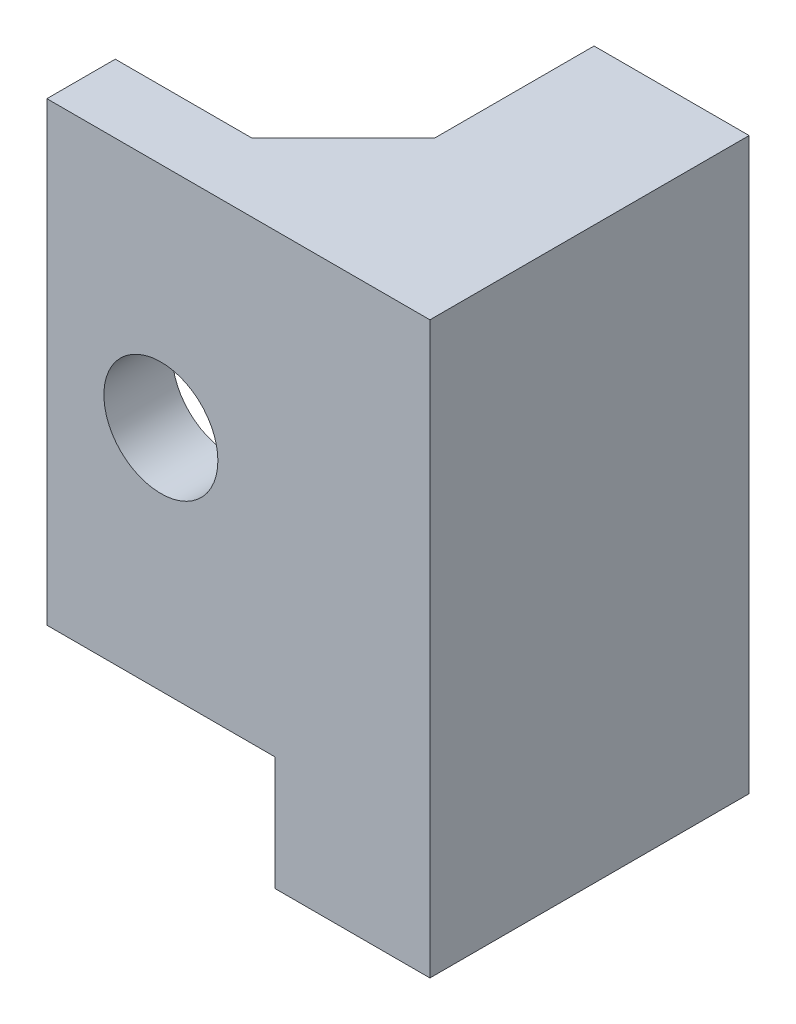
ISO-10303-21;
HEADER;
FILE_DESCRIPTION(('STEP AP214'),'2;1');
FILE_NAME('part.step','',(''),(''),'','','');
FILE_SCHEMA(('AUTOMOTIVE_DESIGN { 1 0 10303 214 1 1 1 1 }'));
ENDSEC;
DATA;
#1=APPLICATION_CONTEXT('core data for automotive mechanical design processes');
#2=APPLICATION_PROTOCOL_DEFINITION('international standard','automotive_design',2000,#1);
#3=PRODUCT_CONTEXT('',#1,'mechanical');
#4=PRODUCT('Part','Part','',(#3));
#5=PRODUCT_RELATED_PRODUCT_CATEGORY('part','',(#4));
#6=PRODUCT_DEFINITION_FORMATION('','',#4);
#7=PRODUCT_DEFINITION_CONTEXT('part definition',#1,'design');
#8=PRODUCT_DEFINITION('design','',#6,#7);
#9=PRODUCT_DEFINITION_SHAPE('','',#8);
#10=(LENGTH_UNIT() NAMED_UNIT(*) SI_UNIT(.MILLI.,.METRE.));
#11=(NAMED_UNIT(*) PLANE_ANGLE_UNIT() SI_UNIT($,.RADIAN.));
#12=(NAMED_UNIT(*) SI_UNIT($,.STERADIAN.) SOLID_ANGLE_UNIT());
#13=UNCERTAINTY_MEASURE_WITH_UNIT(LENGTH_MEASURE(1.E-05),#10,'distance_accuracy_value','');
#14=(GEOMETRIC_REPRESENTATION_CONTEXT(3) GLOBAL_UNCERTAINTY_ASSIGNED_CONTEXT((#13)) GLOBAL_UNIT_ASSIGNED_CONTEXT((#10,
#11,#12)) REPRESENTATION_CONTEXT('',''));
#15=CARTESIAN_POINT('',(0.,0.,0.));
#16=DIRECTION('',(0.,0.,1.));
#17=DIRECTION('',(1.,0.,0.));
#18=AXIS2_PLACEMENT_3D('',#15,#16,#17);
#19=CARTESIAN_POINT('',(0.,0.,-3.));
#20=DIRECTION('',(0.,0.,-1.));
#21=DIRECTION('',(1.,0.,0.));
#22=AXIS2_PLACEMENT_3D('',#19,#20,#21);
#23=PLANE('',#22);
#24=CARTESIAN_POINT('',(5.,-10.,-3.));
#25=DIRECTION('',(0.,0.,1.));
#26=DIRECTION('',(1.,0.,0.));
#27=AXIS2_PLACEMENT_3D('',#24,#25,#26);
#28=CIRCLE('',#27,2.5);
#29=CARTESIAN_POINT('',(7.5,-10.,-3.));
#30=VERTEX_POINT('',#29);
#31=EDGE_CURVE('E210',#30,#30,#28,.T.);
#32=ORIENTED_EDGE('',*,*,#31,.T.);
#33=EDGE_LOOP('',(#32));
#34=FACE_BOUND('',#33,.T.);
#35=DIRECTION('',(-1.,0.,0.));
#36=VECTOR('',#35,1.);
#37=CARTESIAN_POINT('',(0.,-20.,-3.));
#38=LINE('',#37,#36);
#39=CARTESIAN_POINT('',(6.,-20.,-3.));
#40=VERTEX_POINT('',#39);
#41=CARTESIAN_POINT('',(0.,-20.,-3.));
#42=VERTEX_POINT('',#41);
#43=EDGE_CURVE('E148',#40,#42,#38,.T.);
#44=ORIENTED_EDGE('',*,*,#43,.T.);
#45=DIRECTION('',(0.,-1.,0.));
#46=VECTOR('',#45,1.);
#47=CARTESIAN_POINT('',(0.,0.,-3.));
#48=LINE('',#47,#46);
#49=CARTESIAN_POINT('',(0.,0.,-3.));
#50=VERTEX_POINT('',#49);
#51=EDGE_CURVE('E216',#50,#42,#48,.T.);
#52=ORIENTED_EDGE('',*,*,#51,.F.);
#53=DIRECTION('',(-1.,0.,0.));
#54=VECTOR('',#53,1.);
#55=CARTESIAN_POINT('',(0.,0.,-3.));
#56=LINE('',#55,#54);
#57=CARTESIAN_POINT('',(6.,0.,-3.));
#58=VERTEX_POINT('',#57);
#59=EDGE_CURVE('E219',#58,#50,#56,.T.);
#60=ORIENTED_EDGE('',*,*,#59,.F.);
#61=DIRECTION('',(0.,1.,0.));
#62=VECTOR('',#61,1.);
#63=CARTESIAN_POINT('',(6.,-2.,-3.));
#64=LINE('',#63,#62);
#65=CARTESIAN_POINT('',(6.,-2.,-3.));
#66=VERTEX_POINT('',#65);
#67=EDGE_CURVE('E184',#66,#58,#64,.T.);
#68=ORIENTED_EDGE('',*,*,#67,.F.);
#69=DIRECTION('',(-1.,0.,0.));
#70=VECTOR('',#69,1.);
#71=CARTESIAN_POINT('',(6.,-2.,-3.));
#72=LINE('',#71,#70);
#73=CARTESIAN_POINT('',(10.,-2.,-3.));
#74=VERTEX_POINT('',#73);
#75=EDGE_CURVE('E178',#74,#66,#72,.T.);
#76=ORIENTED_EDGE('',*,*,#75,.F.);
#77=DIRECTION('',(0.,-1.,0.));
#78=VECTOR('',#77,1.);
#79=CARTESIAN_POINT('',(10.,0.,-3.));
#80=LINE('',#79,#78);
#81=CARTESIAN_POINT('',(10.,-18.,-3.));
#82=VERTEX_POINT('',#81);
#83=EDGE_CURVE('E143',#74,#82,#80,.T.);
#84=ORIENTED_EDGE('',*,*,#83,.T.);
#85=DIRECTION('',(-1.,0.,0.));
#86=VECTOR('',#85,1.);
#87=CARTESIAN_POINT('',(6.,-18.,-3.));
#88=LINE('',#87,#86);
#89=CARTESIAN_POINT('',(6.,-18.,-3.));
#90=VERTEX_POINT('',#89);
#91=EDGE_CURVE('E129',#82,#90,#88,.T.);
#92=ORIENTED_EDGE('',*,*,#91,.T.);
#93=DIRECTION('',(0.,-1.,0.));
#94=VECTOR('',#93,1.);
#95=CARTESIAN_POINT('',(6.,-18.,-3.));
#96=LINE('',#95,#94);
#97=EDGE_CURVE('E134',#90,#40,#96,.T.);
#98=ORIENTED_EDGE('',*,*,#97,.T.);
#99=EDGE_LOOP('',(#44,#52,#60,#68,#76,#84,#92,#98));
#100=FACE_BOUND('',#99,.T.);
#101=ADVANCED_FACE('F35',(#34,#100),#23,.T.);
#102=CARTESIAN_POINT('',(0.,0.,0.));
#103=DIRECTION('',(0.,0.,-1.));
#104=DIRECTION('',(1.,0.,0.));
#105=AXIS2_PLACEMENT_3D('',#102,#103,#104);
#106=PLANE('',#105);
#107=DIRECTION('',(0.,1.,0.));
#108=VECTOR('',#107,1.);
#109=CARTESIAN_POINT('',(9.99999999999999,0.,0.));
#110=LINE('',#109,#108);
#111=CARTESIAN_POINT('',(10.,-25.,0.));
#112=VERTEX_POINT('',#111);
#113=CARTESIAN_POINT('',(10.,-20.,0.));
#114=VERTEX_POINT('',#113);
#115=EDGE_CURVE('E154',#112,#114,#110,.T.);
#116=ORIENTED_EDGE('',*,*,#115,.F.);
#117=DIRECTION('',(1.,0.,0.));
#118=VECTOR('',#117,1.);
#119=CARTESIAN_POINT('',(0.,-25.,0.));
#120=LINE('',#119,#118);
#121=CARTESIAN_POINT('',(16.8,-25.,0.));
#122=VERTEX_POINT('',#121);
#123=EDGE_CURVE('E187',#112,#122,#120,.T.);
#124=ORIENTED_EDGE('',*,*,#123,.T.);
#125=DIRECTION('',(0.,1.,0.));
#126=VECTOR('',#125,1.);
#127=CARTESIAN_POINT('',(16.8,0.,0.));
#128=LINE('',#127,#126);
#129=CARTESIAN_POINT('',(16.8,0.,0.));
#130=VERTEX_POINT('',#129);
#131=EDGE_CURVE('E225',#122,#130,#128,.T.);
#132=ORIENTED_EDGE('',*,*,#131,.T.);
#133=DIRECTION('',(-1.,0.,0.));
#134=VECTOR('',#133,1.);
#135=CARTESIAN_POINT('',(0.,0.,0.));
#136=LINE('',#135,#134);
#137=CARTESIAN_POINT('',(0.,0.,0.));
#138=VERTEX_POINT('',#137);
#139=EDGE_CURVE('E220',#130,#138,#136,.T.);
#140=ORIENTED_EDGE('',*,*,#139,.T.);
#141=DIRECTION('',(0.,-1.,0.));
#142=VECTOR('',#141,1.);
#143=CARTESIAN_POINT('',(0.,0.,0.));
#144=LINE('',#143,#142);
#145=CARTESIAN_POINT('',(0.,-20.,0.));
#146=VERTEX_POINT('',#145);
#147=EDGE_CURVE('E213',#138,#146,#144,.T.);
#148=ORIENTED_EDGE('',*,*,#147,.T.);
#149=DIRECTION('',(-1.,0.,0.));
#150=VECTOR('',#149,1.);
#151=CARTESIAN_POINT('',(0.,-20.,0.));
#152=LINE('',#151,#150);
#153=EDGE_CURVE('E158',#114,#146,#152,.T.);
#154=ORIENTED_EDGE('',*,*,#153,.F.);
#155=EDGE_LOOP('',(#116,#124,#132,#140,#148,#154));
#156=FACE_BOUND('',#155,.T.);
#157=CARTESIAN_POINT('',(5.,-10.,0.));
#158=DIRECTION('',(0.,0.,1.));
#159=DIRECTION('',(1.,0.,0.));
#160=AXIS2_PLACEMENT_3D('',#157,#158,#159);
#161=CIRCLE('',#160,2.5);
#162=CARTESIAN_POINT('',(7.5,-10.,0.));
#163=VERTEX_POINT('',#162);
#164=EDGE_CURVE('E209',#163,#163,#161,.T.);
#165=ORIENTED_EDGE('',*,*,#164,.F.);
#166=EDGE_LOOP('',(#165));
#167=FACE_BOUND('',#166,.T.);
#168=ADVANCED_FACE('F240',(#156,#167),#106,.F.);
#169=CARTESIAN_POINT('',(0.,0.,-3.));
#170=DIRECTION('',(1.,0.,0.));
#171=DIRECTION('',(0.,1.,0.));
#172=AXIS2_PLACEMENT_3D('',#169,#170,#171);
#173=PLANE('',#172);
#174=ORIENTED_EDGE('',*,*,#147,.F.);
#175=DIRECTION('',(0.,0.,1.));
#176=VECTOR('',#175,1.);
#177=CARTESIAN_POINT('',(0.,0.,-3.));
#178=LINE('',#177,#176);
#179=EDGE_CURVE('E43',#50,#138,#178,.T.);
#180=ORIENTED_EDGE('',*,*,#179,.F.);
#181=ORIENTED_EDGE('',*,*,#51,.T.);
#182=DIRECTION('',(0.,0.,-1.));
#183=VECTOR('',#182,1.);
#184=CARTESIAN_POINT('',(0.,-20.,7.));
#185=LINE('',#184,#183);
#186=EDGE_CURVE('E152',#146,#42,#185,.T.);
#187=ORIENTED_EDGE('',*,*,#186,.F.);
#188=EDGE_LOOP('',(#174,#180,#181,#187));
#189=FACE_BOUND('',#188,.T.);
#190=ADVANCED_FACE('F37',(#189),#173,.F.);
#191=CARTESIAN_POINT('',(16.8,0.,-3.));
#192=DIRECTION('',(-1.,0.,0.));
#193=DIRECTION('',(0.,-1.,0.));
#194=AXIS2_PLACEMENT_3D('',#191,#192,#193);
#195=PLANE('',#194);
#196=ORIENTED_EDGE('',*,*,#131,.F.);
#197=DIRECTION('',(0.,0.,-1.));
#198=VECTOR('',#197,1.);
#199=CARTESIAN_POINT('',(16.8,-25.,0.));
#200=LINE('',#199,#198);
#201=CARTESIAN_POINT('',(16.8,-25.,-14.));
#202=VERTEX_POINT('',#201);
#203=EDGE_CURVE('E191',#122,#202,#200,.T.);
#204=ORIENTED_EDGE('',*,*,#203,.T.);
#205=DIRECTION('',(0.,1.,0.));
#206=VECTOR('',#205,1.);
#207=CARTESIAN_POINT('',(16.8,0.,-14.));
#208=LINE('',#207,#206);
#209=CARTESIAN_POINT('',(16.8,0.,-14.));
#210=VERTEX_POINT('',#209);
#211=EDGE_CURVE('E199',#202,#210,#208,.T.);
#212=ORIENTED_EDGE('',*,*,#211,.T.);
#213=DIRECTION('',(0.,0.,1.));
#214=VECTOR('',#213,1.);
#215=CARTESIAN_POINT('',(16.8,0.,-3.));
#216=LINE('',#215,#214);
#217=EDGE_CURVE('E11',#210,#130,#216,.T.);
#218=ORIENTED_EDGE('',*,*,#217,.T.);
#219=EDGE_LOOP('',(#196,#204,#212,#218));
#220=FACE_BOUND('',#219,.T.);
#221=ADVANCED_FACE('F244',(#220),#195,.F.);
#222=CARTESIAN_POINT('',(0.,0.,-3.));
#223=DIRECTION('',(0.,-1.,0.));
#224=DIRECTION('',(0.,0.,1.));
#225=AXIS2_PLACEMENT_3D('',#222,#223,#224);
#226=PLANE('',#225);
#227=ORIENTED_EDGE('',*,*,#59,.T.);
#228=ORIENTED_EDGE('',*,*,#179,.T.);
#229=ORIENTED_EDGE('',*,*,#139,.F.);
#230=ORIENTED_EDGE('',*,*,#217,.F.);
#231=DIRECTION('',(-1.,0.,0.));
#232=VECTOR('',#231,1.);
#233=CARTESIAN_POINT('',(10.,0.,-14.));
#234=LINE('',#233,#232);
#235=CARTESIAN_POINT('',(10.,0.,-14.));
#236=VERTEX_POINT('',#235);
#237=EDGE_CURVE('E202',#210,#236,#234,.T.);
#238=ORIENTED_EDGE('',*,*,#237,.T.);
#239=DIRECTION('',(0.,0.,1.));
#240=VECTOR('',#239,1.);
#241=CARTESIAN_POINT('',(10.,0.,-14.));
#242=LINE('',#241,#240);
#243=CARTESIAN_POINT('',(10.,0.,-7.));
#244=VERTEX_POINT('',#243);
#245=EDGE_CURVE('E205',#236,#244,#242,.T.);
#246=ORIENTED_EDGE('',*,*,#245,.T.);
#247=DIRECTION('',(0.707106781186548,0.,-0.707106781186548));
#248=VECTOR('',#247,1.);
#249=CARTESIAN_POINT('',(10.,0.,-7.));
#250=LINE('',#249,#248);
#251=EDGE_CURVE('E173',#58,#244,#250,.T.);
#252=ORIENTED_EDGE('',*,*,#251,.F.);
#253=EDGE_LOOP('',(#227,#228,#229,#230,#238,#246,#252));
#254=FACE_BOUND('',#253,.T.);
#255=ADVANCED_FACE('F232',(#254),#226,.F.);
#256=CARTESIAN_POINT('',(5.,-10.,-3.));
#257=DIRECTION('',(0.,0.,1.));
#258=DIRECTION('',(-1.,0.,0.));
#259=AXIS2_PLACEMENT_3D('',#256,#257,#258);
#260=CYLINDRICAL_SURFACE('',#259,2.5);
#261=ORIENTED_EDGE('',*,*,#31,.F.);
#262=EDGE_LOOP('',(#261));
#263=FACE_BOUND('',#262,.T.);
#264=ORIENTED_EDGE('',*,*,#164,.T.);
#265=EDGE_LOOP('',(#264));
#266=FACE_BOUND('',#265,.T.);
#267=ADVANCED_FACE('F279',(#263,#266),#260,.F.);
#268=CARTESIAN_POINT('',(10.,0.,-14.));
#269=DIRECTION('',(1.,0.,0.));
#270=DIRECTION('',(0.,1.,0.));
#271=AXIS2_PLACEMENT_3D('',#268,#269,#270);
#272=PLANE('',#271);
#273=ORIENTED_EDGE('',*,*,#83,.F.);
#274=DIRECTION('',(0.,0.,1.));
#275=VECTOR('',#274,1.);
#276=CARTESIAN_POINT('',(10.,-2.,-3.));
#277=LINE('',#276,#275);
#278=CARTESIAN_POINT('',(10.,-2.,-7.));
#279=VERTEX_POINT('',#278);
#280=EDGE_CURVE('E176',#279,#74,#277,.T.);
#281=ORIENTED_EDGE('',*,*,#280,.F.);
#282=DIRECTION('',(0.,1.,0.));
#283=VECTOR('',#282,1.);
#284=CARTESIAN_POINT('',(10.,-2.,-7.));
#285=LINE('',#284,#283);
#286=EDGE_CURVE('E181',#279,#244,#285,.T.);
#287=ORIENTED_EDGE('',*,*,#286,.T.);
#288=ORIENTED_EDGE('',*,*,#245,.F.);
#289=DIRECTION('',(0.,-1.,0.));
#290=VECTOR('',#289,1.);
#291=CARTESIAN_POINT('',(10.,0.,-14.));
#292=LINE('',#291,#290);
#293=CARTESIAN_POINT('',(10.,-25.,-14.));
#294=VERTEX_POINT('',#293);
#295=EDGE_CURVE('E197',#236,#294,#292,.T.);
#296=ORIENTED_EDGE('',*,*,#295,.T.);
#297=DIRECTION('',(0.,0.,1.));
#298=VECTOR('',#297,1.);
#299=CARTESIAN_POINT('',(10.,-25.,-14.));
#300=LINE('',#299,#298);
#301=EDGE_CURVE('E58',#294,#112,#300,.T.);
#302=ORIENTED_EDGE('',*,*,#301,.T.);
#303=ORIENTED_EDGE('',*,*,#115,.T.);
#304=DIRECTION('',(0.,0.,-1.));
#305=VECTOR('',#304,1.);
#306=CARTESIAN_POINT('',(10.,-20.,7.));
#307=LINE('',#306,#305);
#308=CARTESIAN_POINT('',(10.,-20.,-7.));
#309=VERTEX_POINT('',#308);
#310=EDGE_CURVE('E151',#114,#309,#307,.T.);
#311=ORIENTED_EDGE('',*,*,#310,.T.);
#312=DIRECTION('',(0.,-1.,0.));
#313=VECTOR('',#312,1.);
#314=CARTESIAN_POINT('',(10.,-18.,-7.));
#315=LINE('',#314,#313);
#316=CARTESIAN_POINT('',(10.,-18.,-7.));
#317=VERTEX_POINT('',#316);
#318=EDGE_CURVE('E139',#317,#309,#315,.T.);
#319=ORIENTED_EDGE('',*,*,#318,.F.);
#320=DIRECTION('',(0.,0.,1.));
#321=VECTOR('',#320,1.);
#322=CARTESIAN_POINT('',(10.,-18.,-3.));
#323=LINE('',#322,#321);
#324=EDGE_CURVE('E131',#317,#82,#323,.T.);
#325=ORIENTED_EDGE('',*,*,#324,.T.);
#326=EDGE_LOOP('',(#273,#281,#287,#288,#296,#302,#303,#311,#319,#325));
#327=FACE_BOUND('',#326,.T.);
#328=ADVANCED_FACE('F249',(#327),#272,.F.);
#329=CARTESIAN_POINT('',(0.,0.,-14.));
#330=DIRECTION('',(0.,0.,-1.));
#331=DIRECTION('',(1.,0.,0.));
#332=AXIS2_PLACEMENT_3D('',#329,#330,#331);
#333=PLANE('',#332);
#334=CARTESIAN_POINT('',(11.5297958971133,-15.,-14.));
#335=DIRECTION('',(0.,0.,1.));
#336=DIRECTION('',(1.,0.,0.));
#337=AXIS2_PLACEMENT_3D('',#334,#335,#336);
#338=CIRCLE('',#337,0.799999999999999);
#339=CARTESIAN_POINT('',(12.3297958971133,-15.,-14.));
#340=VERTEX_POINT('',#339);
#341=EDGE_CURVE('E161',#340,#340,#338,.T.);
#342=ORIENTED_EDGE('',*,*,#341,.T.);
#343=EDGE_LOOP('',(#342));
#344=FACE_BOUND('',#343,.T.);
#345=CARTESIAN_POINT('',(11.5297958971133,-22.,-14.));
#346=DIRECTION('',(0.,0.,1.));
#347=DIRECTION('',(1.,0.,0.));
#348=AXIS2_PLACEMENT_3D('',#345,#346,#347);
#349=CIRCLE('',#348,0.799999999999999);
#350=CARTESIAN_POINT('',(12.3297958971133,-22.,-14.));
#351=VERTEX_POINT('',#350);
#352=EDGE_CURVE('E167',#351,#351,#349,.T.);
#353=ORIENTED_EDGE('',*,*,#352,.T.);
#354=EDGE_LOOP('',(#353));
#355=FACE_BOUND('',#354,.T.);
#356=ORIENTED_EDGE('',*,*,#295,.F.);
#357=ORIENTED_EDGE('',*,*,#237,.F.);
#358=ORIENTED_EDGE('',*,*,#211,.F.);
#359=DIRECTION('',(-1.,0.,0.));
#360=VECTOR('',#359,1.);
#361=CARTESIAN_POINT('',(16.8,-25.,-14.));
#362=LINE('',#361,#360);
#363=EDGE_CURVE('E194',#202,#294,#362,.T.);
#364=ORIENTED_EDGE('',*,*,#363,.T.);
#365=EDGE_LOOP('',(#356,#357,#358,#364));
#366=FACE_BOUND('',#365,.T.);
#367=ADVANCED_FACE('F248',(#344,#355,#366),#333,.T.);
#368=CARTESIAN_POINT('',(0.,-25.,0.));
#369=DIRECTION('',(0.,-1.,0.));
#370=DIRECTION('',(0.,0.,1.));
#371=AXIS2_PLACEMENT_3D('',#368,#369,#370);
#372=PLANE('',#371);
#373=ORIENTED_EDGE('',*,*,#301,.F.);
#374=ORIENTED_EDGE('',*,*,#363,.F.);
#375=ORIENTED_EDGE('',*,*,#203,.F.);
#376=ORIENTED_EDGE('',*,*,#123,.F.);
#377=EDGE_LOOP('',(#373,#374,#375,#376));
#378=FACE_BOUND('',#377,.T.);
#379=ADVANCED_FACE('F269',(#378),#372,.T.);
#380=CARTESIAN_POINT('',(10.,-2.,-7.));
#381=DIRECTION('',(-0.707106781186547,0.,-0.707106781186547));
#382=DIRECTION('',(0.707106781186548,0.,-0.707106781186548));
#383=AXIS2_PLACEMENT_3D('',#380,#381,#382);
#384=PLANE('',#383);
#385=ORIENTED_EDGE('',*,*,#251,.T.);
#386=ORIENTED_EDGE('',*,*,#286,.F.);
#387=DIRECTION('',(0.707106781186548,0.,-0.707106781186548));
#388=VECTOR('',#387,1.);
#389=CARTESIAN_POINT('',(10.,-2.,-7.));
#390=LINE('',#389,#388);
#391=EDGE_CURVE('E174',#66,#279,#390,.T.);
#392=ORIENTED_EDGE('',*,*,#391,.F.);
#393=ORIENTED_EDGE('',*,*,#67,.T.);
#394=EDGE_LOOP('',(#385,#386,#392,#393));
#395=FACE_BOUND('',#394,.T.);
#396=ADVANCED_FACE('F253',(#395),#384,.T.);
#397=CARTESIAN_POINT('',(0.,-2.,0.));
#398=DIRECTION('',(0.,-1.,0.));
#399=DIRECTION('',(0.,0.,1.));
#400=AXIS2_PLACEMENT_3D('',#397,#398,#399);
#401=PLANE('',#400);
#402=ORIENTED_EDGE('',*,*,#391,.T.);
#403=ORIENTED_EDGE('',*,*,#280,.T.);
#404=ORIENTED_EDGE('',*,*,#75,.T.);
#405=EDGE_LOOP('',(#402,#403,#404));
#406=FACE_BOUND('',#405,.T.);
#407=ADVANCED_FACE('F258',(#406),#401,.T.);
#408=CARTESIAN_POINT('',(11.5297958971133,-22.,-4.));
#409=DIRECTION('',(0.,0.,-1.));
#410=DIRECTION('',(1.,0.,0.));
#411=AXIS2_PLACEMENT_3D('',#408,#409,#410);
#412=CONICAL_SURFACE('',#411,0.799999999999997,1.02974425867665);
#413=CARTESIAN_POINT('',(11.5297958971133,-22.,-3.51931150477795));
#414=VERTEX_POINT('',#413);
#415=VERTEX_LOOP('',#414);
#416=FACE_BOUND('',#415,.T.);
#417=CARTESIAN_POINT('',(11.5297958971133,-22.,-4.));
#418=DIRECTION('',(0.,0.,1.));
#419=DIRECTION('',(1.,0.,0.));
#420=AXIS2_PLACEMENT_3D('',#417,#418,#419);
#421=CIRCLE('',#420,0.799999999999997);
#422=CARTESIAN_POINT('',(12.3297958971133,-22.,-4.));
#423=VERTEX_POINT('',#422);
#424=EDGE_CURVE('E170',#423,#423,#421,.T.);
#425=ORIENTED_EDGE('',*,*,#424,.F.);
#426=EDGE_LOOP('',(#425));
#427=FACE_BOUND('',#426,.T.);
#428=ADVANCED_FACE('F260',(#416,#427),#412,.F.);
#429=CARTESIAN_POINT('',(11.5297958971133,-22.,-14.));
#430=DIRECTION('',(0.,0.,-1.));
#431=DIRECTION('',(1.,0.,0.));
#432=AXIS2_PLACEMENT_3D('',#429,#430,#431);
#433=CYLINDRICAL_SURFACE('',#432,0.799999999999998);
#434=ORIENTED_EDGE('',*,*,#424,.T.);
#435=EDGE_LOOP('',(#434));
#436=FACE_BOUND('',#435,.T.);
#437=ORIENTED_EDGE('',*,*,#352,.F.);
#438=EDGE_LOOP('',(#437));
#439=FACE_BOUND('',#438,.T.);
#440=ADVANCED_FACE('F266',(#436,#439),#433,.F.);
#441=CARTESIAN_POINT('',(11.5297958971133,-15.,-4.));
#442=DIRECTION('',(0.,0.,-1.));
#443=DIRECTION('',(1.,0.,0.));
#444=AXIS2_PLACEMENT_3D('',#441,#442,#443);
#445=CONICAL_SURFACE('',#444,0.799999999999997,1.02974425867665);
#446=CARTESIAN_POINT('',(11.5297958971133,-15.,-3.51931150477795));
#447=VERTEX_POINT('',#446);
#448=VERTEX_LOOP('',#447);
#449=FACE_BOUND('',#448,.T.);
#450=CARTESIAN_POINT('',(11.5297958971133,-15.,-4.));
#451=DIRECTION('',(0.,0.,1.));
#452=DIRECTION('',(1.,0.,0.));
#453=AXIS2_PLACEMENT_3D('',#450,#451,#452);
#454=CIRCLE('',#453,0.799999999999997);
#455=CARTESIAN_POINT('',(12.3297958971133,-15.,-4.));
#456=VERTEX_POINT('',#455);
#457=EDGE_CURVE('E164',#456,#456,#454,.T.);
#458=ORIENTED_EDGE('',*,*,#457,.F.);
#459=EDGE_LOOP('',(#458));
#460=FACE_BOUND('',#459,.T.);
#461=ADVANCED_FACE('F391',(#449,#460),#445,.F.);
#462=CARTESIAN_POINT('',(11.5297958971133,-15.,-14.));
#463=DIRECTION('',(0.,0.,-1.));
#464=DIRECTION('',(1.,0.,0.));
#465=AXIS2_PLACEMENT_3D('',#462,#463,#464);
#466=CYLINDRICAL_SURFACE('',#465,0.799999999999998);
#467=ORIENTED_EDGE('',*,*,#457,.T.);
#468=EDGE_LOOP('',(#467));
#469=FACE_BOUND('',#468,.T.);
#470=ORIENTED_EDGE('',*,*,#341,.F.);
#471=EDGE_LOOP('',(#470));
#472=FACE_BOUND('',#471,.T.);
#473=ADVANCED_FACE('F400',(#469,#472),#466,.F.);
#474=CARTESIAN_POINT('',(0.,-20.,7.));
#475=DIRECTION('',(0.,1.,0.));
#476=DIRECTION('',(-1.,0.,0.));
#477=AXIS2_PLACEMENT_3D('',#474,#475,#476);
#478=PLANE('',#477);
#479=ORIENTED_EDGE('',*,*,#310,.F.);
#480=ORIENTED_EDGE('',*,*,#153,.T.);
#481=ORIENTED_EDGE('',*,*,#186,.T.);
#482=ORIENTED_EDGE('',*,*,#43,.F.);
#483=DIRECTION('',(0.707106781186548,0.,-0.707106781186548));
#484=VECTOR('',#483,1.);
#485=CARTESIAN_POINT('',(10.,-20.,-7.));
#486=LINE('',#485,#484);
#487=EDGE_CURVE('E50',#40,#309,#486,.T.);
#488=ORIENTED_EDGE('',*,*,#487,.T.);
#489=EDGE_LOOP('',(#479,#480,#481,#482,#488));
#490=FACE_BOUND('',#489,.T.);
#491=ADVANCED_FACE('F256',(#490),#478,.F.);
#492=CARTESIAN_POINT('',(10.,-18.,-7.));
#493=DIRECTION('',(0.707106781186547,0.,0.707106781186547));
#494=DIRECTION('',(-0.707106781186548,0.,0.707106781186548));
#495=AXIS2_PLACEMENT_3D('',#492,#493,#494);
#496=PLANE('',#495);
#497=ORIENTED_EDGE('',*,*,#487,.F.);
#498=ORIENTED_EDGE('',*,*,#97,.F.);
#499=DIRECTION('',(0.707106781186548,0.,-0.707106781186548));
#500=VECTOR('',#499,1.);
#501=CARTESIAN_POINT('',(10.,-18.,-7.));
#502=LINE('',#501,#500);
#503=EDGE_CURVE('E126',#90,#317,#502,.T.);
#504=ORIENTED_EDGE('',*,*,#503,.T.);
#505=ORIENTED_EDGE('',*,*,#318,.T.);
#506=EDGE_LOOP('',(#497,#498,#504,#505));
#507=FACE_BOUND('',#506,.T.);
#508=ADVANCED_FACE('F135',(#507),#496,.F.);
#509=CARTESIAN_POINT('',(0.,-18.,0.));
#510=DIRECTION('',(0.,1.,0.));
#511=DIRECTION('',(0.,0.,1.));
#512=AXIS2_PLACEMENT_3D('',#509,#510,#511);
#513=PLANE('',#512);
#514=ORIENTED_EDGE('',*,*,#503,.F.);
#515=ORIENTED_EDGE('',*,*,#91,.F.);
#516=ORIENTED_EDGE('',*,*,#324,.F.);
#517=EDGE_LOOP('',(#514,#515,#516));
#518=FACE_BOUND('',#517,.T.);
#519=ADVANCED_FACE('F127',(#518),#513,.T.);
#520=CLOSED_SHELL('',(#101,#168,#190,#221,#255,#267,#328,#367,#379,#396,#407,#428,#440,#461,
#473,#491,#508,#519));
#521=MANIFOLD_SOLID_BREP('B2',#520);
#522=ADVANCED_BREP_SHAPE_REPRESENTATION('',(#18,#521),#14);
#523=SHAPE_DEFINITION_REPRESENTATION(#9,#522);
ENDSEC;
END-ISO-10303-21;
